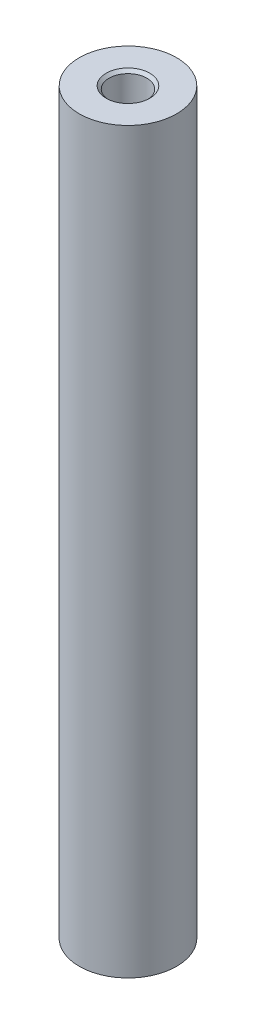
ISO-10303-21;
HEADER;
FILE_DESCRIPTION(('STEP AP214'),'2;1');
FILE_NAME('part.step','',(''),(''),'','','');
FILE_SCHEMA(('AUTOMOTIVE_DESIGN { 1 0 10303 214 1 1 1 1 }'));
ENDSEC;
DATA;
#1=APPLICATION_CONTEXT('core data for automotive mechanical design processes');
#2=APPLICATION_PROTOCOL_DEFINITION('international standard','automotive_design',2000,#1);
#3=PRODUCT_CONTEXT('',#1,'mechanical');
#4=PRODUCT('Part','Part','',(#3));
#5=PRODUCT_RELATED_PRODUCT_CATEGORY('part','',(#4));
#6=PRODUCT_DEFINITION_FORMATION('','',#4);
#7=PRODUCT_DEFINITION_CONTEXT('part definition',#1,'design');
#8=PRODUCT_DEFINITION('design','',#6,#7);
#9=PRODUCT_DEFINITION_SHAPE('','',#8);
#10=(LENGTH_UNIT() NAMED_UNIT(*) SI_UNIT(.MILLI.,.METRE.));
#11=(NAMED_UNIT(*) PLANE_ANGLE_UNIT() SI_UNIT($,.RADIAN.));
#12=(NAMED_UNIT(*) SI_UNIT($,.STERADIAN.) SOLID_ANGLE_UNIT());
#13=UNCERTAINTY_MEASURE_WITH_UNIT(LENGTH_MEASURE(1.E-05),#10,'distance_accuracy_value','');
#14=(GEOMETRIC_REPRESENTATION_CONTEXT(3) GLOBAL_UNCERTAINTY_ASSIGNED_CONTEXT((#13)) GLOBAL_UNIT_ASSIGNED_CONTEXT((#10,
#11,#12)) REPRESENTATION_CONTEXT('',''));
#15=CARTESIAN_POINT('',(0.,0.,0.));
#16=DIRECTION('',(0.,0.,1.));
#17=DIRECTION('',(1.,0.,0.));
#18=AXIS2_PLACEMENT_3D('',#15,#16,#17);
#19=CARTESIAN_POINT('',(0.,76.9,0.));
#20=DIRECTION('',(0.,-1.,0.));
#21=DIRECTION('',(0.,0.,-1.));
#22=AXIS2_PLACEMENT_3D('',#19,#20,#21);
#23=CYLINDRICAL_SURFACE('',#22,5.07);
#24=CARTESIAN_POINT('',(0.,76.9,0.));
#25=DIRECTION('',(0.,1.,0.));
#26=DIRECTION('',(0.,0.,1.));
#27=AXIS2_PLACEMENT_3D('',#24,#25,#26);
#28=CIRCLE('',#27,5.07);
#29=CARTESIAN_POINT('',(0.,76.9,5.07));
#30=VERTEX_POINT('',#29);
#31=EDGE_CURVE('E61',#30,#30,#28,.T.);
#32=ORIENTED_EDGE('',*,*,#31,.F.);
#33=EDGE_LOOP('',(#32));
#34=FACE_BOUND('',#33,.T.);
#35=CARTESIAN_POINT('',(0.,0.,0.));
#36=DIRECTION('',(0.,1.,0.));
#37=DIRECTION('',(0.,0.,1.));
#38=AXIS2_PLACEMENT_3D('',#35,#36,#37);
#39=CIRCLE('',#38,5.07);
#40=CARTESIAN_POINT('',(0.,0.,5.07));
#41=VERTEX_POINT('',#40);
#42=EDGE_CURVE('E62',#41,#41,#39,.T.);
#43=ORIENTED_EDGE('',*,*,#42,.T.);
#44=EDGE_LOOP('',(#43));
#45=FACE_BOUND('',#44,.T.);
#46=ADVANCED_FACE('F37',(#34,#45),#23,.T.);
#47=CARTESIAN_POINT('',(0.,76.9,0.));
#48=DIRECTION('',(0.,1.,0.));
#49=DIRECTION('',(0.,0.,1.));
#50=AXIS2_PLACEMENT_3D('',#47,#48,#49);
#51=PLANE('',#50);
#52=CARTESIAN_POINT('',(0.,76.9,0.));
#53=DIRECTION('',(0.,1.,0.));
#54=DIRECTION('',(0.,0.,1.));
#55=AXIS2_PLACEMENT_3D('',#52,#53,#54);
#56=CIRCLE('',#55,2.27000000000002);
#57=CARTESIAN_POINT('',(0.,76.9,2.27000000000002));
#58=VERTEX_POINT('',#57);
#59=EDGE_CURVE('E50',#58,#58,#56,.F.);
#60=ORIENTED_EDGE('',*,*,#59,.T.);
#61=EDGE_LOOP('',(#60));
#62=FACE_BOUND('',#61,.T.);
#63=ORIENTED_EDGE('',*,*,#31,.T.);
#64=EDGE_LOOP('',(#63));
#65=FACE_BOUND('',#64,.T.);
#66=ADVANCED_FACE('F93',(#62,#65),#51,.T.);
#67=CARTESIAN_POINT('',(0.,0.,0.));
#68=DIRECTION('',(0.,1.,0.));
#69=DIRECTION('',(0.,0.,1.));
#70=AXIS2_PLACEMENT_3D('',#67,#68,#69);
#71=PLANE('',#70);
#72=CARTESIAN_POINT('',(0.,0.,0.));
#73=DIRECTION('',(0.,1.,0.));
#74=DIRECTION('',(0.,0.,1.));
#75=AXIS2_PLACEMENT_3D('',#72,#73,#74);
#76=CIRCLE('',#75,2.27000000000003);
#77=CARTESIAN_POINT('',(0.,0.,2.27000000000003));
#78=VERTEX_POINT('',#77);
#79=EDGE_CURVE('E10',#78,#78,#76,.T.);
#80=ORIENTED_EDGE('',*,*,#79,.T.);
#81=EDGE_LOOP('',(#80));
#82=FACE_BOUND('',#81,.T.);
#83=ORIENTED_EDGE('',*,*,#42,.F.);
#84=EDGE_LOOP('',(#83));
#85=FACE_BOUND('',#84,.T.);
#86=ADVANCED_FACE('F99',(#82,#85),#71,.F.);
#87=CARTESIAN_POINT('',(0.,61.7,0.));
#88=DIRECTION('',(0.,1.,0.));
#89=DIRECTION('',(0.,0.,1.));
#90=AXIS2_PLACEMENT_3D('',#87,#88,#89);
#91=CYLINDRICAL_SURFACE('',#90,1.97);
#92=CARTESIAN_POINT('',(0.,76.6,0.));
#93=DIRECTION('',(0.,1.,0.));
#94=DIRECTION('',(0.,0.,1.));
#95=AXIS2_PLACEMENT_3D('',#92,#93,#94);
#96=CIRCLE('',#95,1.97);
#97=CARTESIAN_POINT('',(0.,76.6,1.97));
#98=VERTEX_POINT('',#97);
#99=EDGE_CURVE('E55',#98,#98,#96,.T.);
#100=CARTESIAN_POINT('',(0.,61.7,0.));
#101=DIRECTION('',(0.,1.,0.));
#102=DIRECTION('',(0.,0.,1.));
#103=AXIS2_PLACEMENT_3D('',#100,#101,#102);
#104=CIRCLE('',#103,1.97);
#105=CARTESIAN_POINT('',(0.,61.7,1.97));
#106=VERTEX_POINT('',#105);
#107=EDGE_CURVE('E66',#106,#106,#104,.T.);
#108=CARTESIAN_POINT('',(0.,76.6,1.97));
#109=CARTESIAN_POINT('',(0.,76.4447916666666,1.97));
#110=CARTESIAN_POINT('',(0.,76.2895833333333,1.97));
#111=CARTESIAN_POINT('',(0.,75.9791666666666,1.97));
#112=CARTESIAN_POINT('',(0.,75.8239583333333,1.97));
#113=CARTESIAN_POINT('',(0.,75.5135416666666,1.97));
#114=CARTESIAN_POINT('',(0.,75.3583333333333,1.97));
#115=CARTESIAN_POINT('',(0.,75.0479166666667,1.97));
#116=CARTESIAN_POINT('',(0.,74.8927083333333,1.97));
#117=CARTESIAN_POINT('',(0.,74.5822916666666,1.97));
#118=CARTESIAN_POINT('',(0.,74.4270833333333,1.97));
#119=CARTESIAN_POINT('',(0.,74.1166666666666,1.97));
#120=CARTESIAN_POINT('',(0.,73.9614583333333,1.97));
#121=CARTESIAN_POINT('',(0.,73.6510416666667,1.97));
#122=CARTESIAN_POINT('',(0.,73.4958333333333,1.97));
#123=CARTESIAN_POINT('',(0.,73.1854166666667,1.97));
#124=CARTESIAN_POINT('',(0.,73.0302083333333,1.97));
#125=CARTESIAN_POINT('',(0.,72.7197916666667,1.97));
#126=CARTESIAN_POINT('',(0.,72.5645833333333,1.97));
#127=CARTESIAN_POINT('',(0.,72.2541666666666,1.97));
#128=CARTESIAN_POINT('',(0.,72.0989583333333,1.97));
#129=CARTESIAN_POINT('',(0.,71.7885416666666,1.97));
#130=CARTESIAN_POINT('',(0.,71.6333333333333,1.97));
#131=CARTESIAN_POINT('',(0.,71.3229166666667,1.97));
#132=CARTESIAN_POINT('',(0.,71.1677083333333,1.97));
#133=CARTESIAN_POINT('',(0.,70.8572916666667,1.97));
#134=CARTESIAN_POINT('',(0.,70.7020833333333,1.97));
#135=CARTESIAN_POINT('',(0.,70.3916666666667,1.97));
#136=CARTESIAN_POINT('',(0.,70.2364583333333,1.97));
#137=CARTESIAN_POINT('',(0.,69.9260416666667,1.97));
#138=CARTESIAN_POINT('',(0.,69.7708333333333,1.97));
#139=CARTESIAN_POINT('',(0.,69.4604166666666,1.97));
#140=CARTESIAN_POINT('',(0.,69.3052083333333,1.97));
#141=CARTESIAN_POINT('',(0.,68.9947916666667,1.97));
#142=CARTESIAN_POINT('',(0.,68.8395833333333,1.97));
#143=CARTESIAN_POINT('',(0.,68.5291666666667,1.97));
#144=CARTESIAN_POINT('',(0.,68.3739583333333,1.97));
#145=CARTESIAN_POINT('',(0.,68.0635416666667,1.97));
#146=CARTESIAN_POINT('',(0.,67.9083333333333,1.97));
#147=CARTESIAN_POINT('',(0.,67.5979166666667,1.97));
#148=CARTESIAN_POINT('',(0.,67.4427083333333,1.97));
#149=CARTESIAN_POINT('',(0.,67.1322916666667,1.97));
#150=CARTESIAN_POINT('',(0.,66.9770833333333,1.97));
#151=CARTESIAN_POINT('',(0.,66.6666666666667,1.97));
#152=CARTESIAN_POINT('',(0.,66.5114583333333,1.97));
#153=CARTESIAN_POINT('',(0.,66.2010416666667,1.97));
#154=CARTESIAN_POINT('',(0.,66.0458333333333,1.97));
#155=CARTESIAN_POINT('',(0.,65.7354166666667,1.97));
#156=CARTESIAN_POINT('',(0.,65.5802083333333,1.97));
#157=CARTESIAN_POINT('',(0.,65.2697916666667,1.97));
#158=CARTESIAN_POINT('',(0.,65.1145833333333,1.97));
#159=CARTESIAN_POINT('',(0.,64.8041666666667,1.97));
#160=CARTESIAN_POINT('',(0.,64.6489583333333,1.97));
#161=CARTESIAN_POINT('',(0.,64.3385416666667,1.97));
#162=CARTESIAN_POINT('',(0.,64.1833333333333,1.97));
#163=CARTESIAN_POINT('',(0.,63.8729166666667,1.97));
#164=CARTESIAN_POINT('',(0.,63.7177083333333,1.97));
#165=CARTESIAN_POINT('',(0.,63.4072916666667,1.97));
#166=CARTESIAN_POINT('',(0.,63.2520833333333,1.97));
#167=CARTESIAN_POINT('',(0.,62.9416666666667,1.97));
#168=CARTESIAN_POINT('',(0.,62.7864583333333,1.97));
#169=CARTESIAN_POINT('',(0.,62.4760416666667,1.97));
#170=CARTESIAN_POINT('',(0.,62.3208333333333,1.97));
#171=CARTESIAN_POINT('',(0.,62.0104166666667,1.97));
#172=CARTESIAN_POINT('',(0.,61.8552083333333,1.97));
#173=CARTESIAN_POINT('',(0.,61.7,1.97));
#174=B_SPLINE_CURVE_WITH_KNOTS('',3,(#108,#109,#110,#111,#112,#113,#114,#115,#116,#117,#118,
#119,#120,#121,#122,#123,#124,#125,#126,#127,#128,#129,#130,#131,#132,#133,#134,#135,#136,#137,
#138,#139,#140,#141,#142,#143,#144,#145,#146,#147,#148,#149,#150,#151,#152,#153,#154,#155,#156,
#157,#158,#159,#160,#161,#162,#163,#164,#165,#166,#167,#168,#169,#170,#171,#172,#173),
.UNSPECIFIED.,.F.,.F.,(4,2,2,2,2,2,2,2,2,2,2,2,2,2,2,2,2,2,2,2,2,2,2,2,2,2,2,2,2,2,2,2,4),(0.,
0.465625000000011,0.931250000000008,1.39687500000001,1.8625,2.328125,2.79375,3.259375,
3.72499999999999,4.190625,4.65625,5.121875,5.5875,6.05312499999999,6.51874999999999,6.984375,
7.45,7.915625,8.38124999999999,8.84687499999999,9.31249999999999,9.77812499999999,10.24375,
10.709375,11.175,11.640625,12.10625,12.571875,13.0375,13.503125,13.96875,14.434375,14.9),.UNSPECIFIED.);
#175=EDGE_CURVE('BSEAM106',#98,#106,#174,.T.);
#176=ORIENTED_EDGE('',*,*,#99,.T.);
#177=ORIENTED_EDGE('',*,*,#107,.F.);
#178=ORIENTED_EDGE('',*,*,#175,.T.);
#179=ORIENTED_EDGE('',*,*,#175,.F.);
#180=EDGE_LOOP('',(#176,#178,#177,#179));
#181=FACE_BOUND('',#180,.T.);
#182=ADVANCED_FACE('F106',(#181),#91,.F.);
#183=CARTESIAN_POINT('',(0.,61.7,0.));
#184=DIRECTION('',(0.,1.,0.));
#185=DIRECTION('',(0.,0.,1.));
#186=AXIS2_PLACEMENT_3D('',#183,#184,#185);
#187=PLANE('',#186);
#188=ORIENTED_EDGE('',*,*,#107,.T.);
#189=EDGE_LOOP('',(#188));
#190=FACE_BOUND('',#189,.T.);
#191=ADVANCED_FACE('F89',(#190),#187,.T.);
#192=CARTESIAN_POINT('',(0.,76.6,0.));
#193=DIRECTION('',(0.,1.,0.));
#194=DIRECTION('',(0.,0.,1.));
#195=AXIS2_PLACEMENT_3D('',#192,#193,#194);
#196=CONICAL_SURFACE('',#195,1.97,0.785398163397448);
#197=ORIENTED_EDGE('',*,*,#59,.F.);
#198=EDGE_LOOP('',(#197));
#199=FACE_BOUND('',#198,.T.);
#200=ORIENTED_EDGE('',*,*,#99,.F.);
#201=EDGE_LOOP('',(#200));
#202=FACE_BOUND('',#201,.T.);
#203=ADVANCED_FACE('F82',(#199,#202),#196,.F.);
#204=CARTESIAN_POINT('',(0.,15.2,0.));
#205=DIRECTION('',(0.,-1.,0.));
#206=DIRECTION('',(0.,0.,-1.));
#207=AXIS2_PLACEMENT_3D('',#204,#205,#206);
#208=CYLINDRICAL_SURFACE('',#207,1.97);
#209=CARTESIAN_POINT('',(0.,0.300000000000031,0.));
#210=DIRECTION('',(0.,1.,0.));
#211=DIRECTION('',(0.,0.,1.));
#212=AXIS2_PLACEMENT_3D('',#209,#210,#211);
#213=CIRCLE('',#212,1.97);
#214=CARTESIAN_POINT('',(0.,0.300000000000029,-1.97));
#215=VERTEX_POINT('',#214);
#216=EDGE_CURVE('E45',#215,#215,#213,.F.);
#217=CARTESIAN_POINT('',(0.,15.2,0.));
#218=DIRECTION('',(0.,-1.,0.));
#219=DIRECTION('',(0.,0.,-1.));
#220=AXIS2_PLACEMENT_3D('',#217,#218,#219);
#221=CIRCLE('',#220,1.97);
#222=CARTESIAN_POINT('',(0.,15.2,-1.97));
#223=VERTEX_POINT('',#222);
#224=EDGE_CURVE('E73',#223,#223,#221,.T.);
#225=CARTESIAN_POINT('',(0.,0.300000000000029,-1.97));
#226=CARTESIAN_POINT('',(0.,0.455208333333363,-1.97));
#227=CARTESIAN_POINT('',(0.,0.610416666666695,-1.97));
#228=CARTESIAN_POINT('',(0.,0.920833333333361,-1.97));
#229=CARTESIAN_POINT('',(0.,1.07604166666669,-1.97));
#230=CARTESIAN_POINT('',(0.,1.38645833333336,-1.97));
#231=CARTESIAN_POINT('',(0.,1.54166666666669,-1.97));
#232=CARTESIAN_POINT('',(0.,1.85208333333336,-1.97));
#233=CARTESIAN_POINT('',(0.,2.00729166666669,-1.97));
#234=CARTESIAN_POINT('',(0.,2.31770833333336,-1.97));
#235=CARTESIAN_POINT('',(0.,2.47291666666669,-1.97));
#236=CARTESIAN_POINT('',(0.,2.78333333333336,-1.97));
#237=CARTESIAN_POINT('',(0.,2.93854166666669,-1.97));
#238=CARTESIAN_POINT('',(0.,3.24895833333336,-1.97));
#239=CARTESIAN_POINT('',(0.,3.40416666666669,-1.97));
#240=CARTESIAN_POINT('',(0.,3.71458333333336,-1.97));
#241=CARTESIAN_POINT('',(0.,3.86979166666669,-1.97));
#242=CARTESIAN_POINT('',(0.,4.18020833333336,-1.97));
#243=CARTESIAN_POINT('',(0.,4.33541666666669,-1.97));
#244=CARTESIAN_POINT('',(0.,4.64583333333336,-1.97));
#245=CARTESIAN_POINT('',(0.,4.80104166666669,-1.97));
#246=CARTESIAN_POINT('',(0.,5.11145833333335,-1.97));
#247=CARTESIAN_POINT('',(0.,5.26666666666669,-1.97));
#248=CARTESIAN_POINT('',(0.,5.57708333333335,-1.97));
#249=CARTESIAN_POINT('',(0.,5.73229166666669,-1.97));
#250=CARTESIAN_POINT('',(0.,6.04270833333335,-1.97));
#251=CARTESIAN_POINT('',(0.,6.19791666666669,-1.97));
#252=CARTESIAN_POINT('',(0.,6.50833333333335,-1.97));
#253=CARTESIAN_POINT('',(0.,6.66354166666668,-1.97));
#254=CARTESIAN_POINT('',(0.,6.97395833333335,-1.97));
#255=CARTESIAN_POINT('',(0.,7.12916666666668,-1.97));
#256=CARTESIAN_POINT('',(0.,7.43958333333335,-1.97));
#257=CARTESIAN_POINT('',(0.,7.59479166666668,-1.97));
#258=CARTESIAN_POINT('',(0.,7.90520833333335,-1.97));
#259=CARTESIAN_POINT('',(0.,8.06041666666668,-1.97));
#260=CARTESIAN_POINT('',(0.,8.37083333333335,-1.97));
#261=CARTESIAN_POINT('',(0.,8.52604166666668,-1.97));
#262=CARTESIAN_POINT('',(0.,8.83645833333335,-1.97));
#263=CARTESIAN_POINT('',(0.,8.99166666666668,-1.97));
#264=CARTESIAN_POINT('',(0.,9.30208333333334,-1.97));
#265=CARTESIAN_POINT('',(0.,9.45729166666668,-1.97));
#266=CARTESIAN_POINT('',(0.,9.76770833333334,-1.97));
#267=CARTESIAN_POINT('',(0.,9.92291666666668,-1.97));
#268=CARTESIAN_POINT('',(0.,10.2333333333333,-1.97));
#269=CARTESIAN_POINT('',(0.,10.3885416666667,-1.97));
#270=CARTESIAN_POINT('',(0.,10.6989583333333,-1.97));
#271=CARTESIAN_POINT('',(0.,10.8541666666667,-1.97));
#272=CARTESIAN_POINT('',(0.,11.1645833333333,-1.97));
#273=CARTESIAN_POINT('',(0.,11.3197916666667,-1.97));
#274=CARTESIAN_POINT('',(0.,11.6302083333333,-1.97));
#275=CARTESIAN_POINT('',(0.,11.7854166666667,-1.97));
#276=CARTESIAN_POINT('',(0.,12.0958333333333,-1.97));
#277=CARTESIAN_POINT('',(0.,12.2510416666667,-1.97));
#278=CARTESIAN_POINT('',(0.,12.5614583333333,-1.97));
#279=CARTESIAN_POINT('',(0.,12.7166666666667,-1.97));
#280=CARTESIAN_POINT('',(0.,13.0270833333333,-1.97));
#281=CARTESIAN_POINT('',(0.,13.1822916666667,-1.97));
#282=CARTESIAN_POINT('',(0.,13.4927083333333,-1.97));
#283=CARTESIAN_POINT('',(0.,13.6479166666667,-1.97));
#284=CARTESIAN_POINT('',(0.,13.9583333333333,-1.97));
#285=CARTESIAN_POINT('',(0.,14.1135416666667,-1.97));
#286=CARTESIAN_POINT('',(0.,14.4239583333333,-1.97));
#287=CARTESIAN_POINT('',(0.,14.5791666666667,-1.97));
#288=CARTESIAN_POINT('',(0.,14.8895833333333,-1.97));
#289=CARTESIAN_POINT('',(0.,15.0447916666667,-1.97));
#290=CARTESIAN_POINT('',(0.,15.2,-1.97));
#291=B_SPLINE_CURVE_WITH_KNOTS('',3,(#225,#226,#227,#228,#229,#230,#231,#232,#233,#234,#235,
#236,#237,#238,#239,#240,#241,#242,#243,#244,#245,#246,#247,#248,#249,#250,#251,#252,#253,#254,
#255,#256,#257,#258,#259,#260,#261,#262,#263,#264,#265,#266,#267,#268,#269,#270,#271,#272,#273,
#274,#275,#276,#277,#278,#279,#280,#281,#282,#283,#284,#285,#286,#287,#288,#289,#290),
.UNSPECIFIED.,.F.,.F.,(4,2,2,2,2,2,2,2,2,2,2,2,2,2,2,2,2,2,2,2,2,2,2,2,2,2,2,2,2,2,2,2,4),(0.,
0.465624999999999,0.931249999999998,1.396875,1.8625,2.328125,2.79374999999999,3.259375,
3.72499999999999,4.19062499999999,4.65624999999999,5.12187499999999,5.58749999999999,
6.05312499999999,6.51874999999999,6.98437499999999,7.44999999999999,7.91562499999999,
8.38124999999998,8.84687499999998,9.31249999999998,9.77812499999998,10.24375,10.709375,11.175,
11.640625,12.10625,12.571875,13.0375,13.503125,13.96875,14.434375,14.9),.UNSPECIFIED.);
#292=EDGE_CURVE('BSEAM80',#215,#223,#291,.T.);
#293=ORIENTED_EDGE('',*,*,#216,.T.);
#294=ORIENTED_EDGE('',*,*,#224,.F.);
#295=ORIENTED_EDGE('',*,*,#292,.T.);
#296=ORIENTED_EDGE('',*,*,#292,.F.);
#297=EDGE_LOOP('',(#293,#295,#294,#296));
#298=FACE_BOUND('',#297,.T.);
#299=ADVANCED_FACE('F80',(#298),#208,.F.);
#300=CARTESIAN_POINT('',(0.,15.2,0.));
#301=DIRECTION('',(0.,-1.,0.));
#302=DIRECTION('',(0.,0.,-1.));
#303=AXIS2_PLACEMENT_3D('',#300,#301,#302);
#304=PLANE('',#303);
#305=ORIENTED_EDGE('',*,*,#224,.T.);
#306=EDGE_LOOP('',(#305));
#307=FACE_BOUND('',#306,.T.);
#308=ADVANCED_FACE('F78',(#307),#304,.T.);
#309=CARTESIAN_POINT('',(0.,0.300000000000031,0.));
#310=DIRECTION('',(0.,-1.,0.));
#311=DIRECTION('',(0.,0.,-1.));
#312=AXIS2_PLACEMENT_3D('',#309,#310,#311);
#313=CONICAL_SURFACE('',#312,1.97,0.785398163397444);
#314=ORIENTED_EDGE('',*,*,#79,.F.);
#315=EDGE_LOOP('',(#314));
#316=FACE_BOUND('',#315,.T.);
#317=ORIENTED_EDGE('',*,*,#216,.F.);
#318=EDGE_LOOP('',(#317));
#319=FACE_BOUND('',#318,.T.);
#320=ADVANCED_FACE('F39',(#316,#319),#313,.F.);
#321=CLOSED_SHELL('',(#46,#66,#86,#182,#191,#203,#299,#308,#320));
#322=MANIFOLD_SOLID_BREP('B2',#321);
#323=ADVANCED_BREP_SHAPE_REPRESENTATION('',(#18,#322),#14);
#324=SHAPE_DEFINITION_REPRESENTATION(#9,#323);
ENDSEC;
END-ISO-10303-21;
